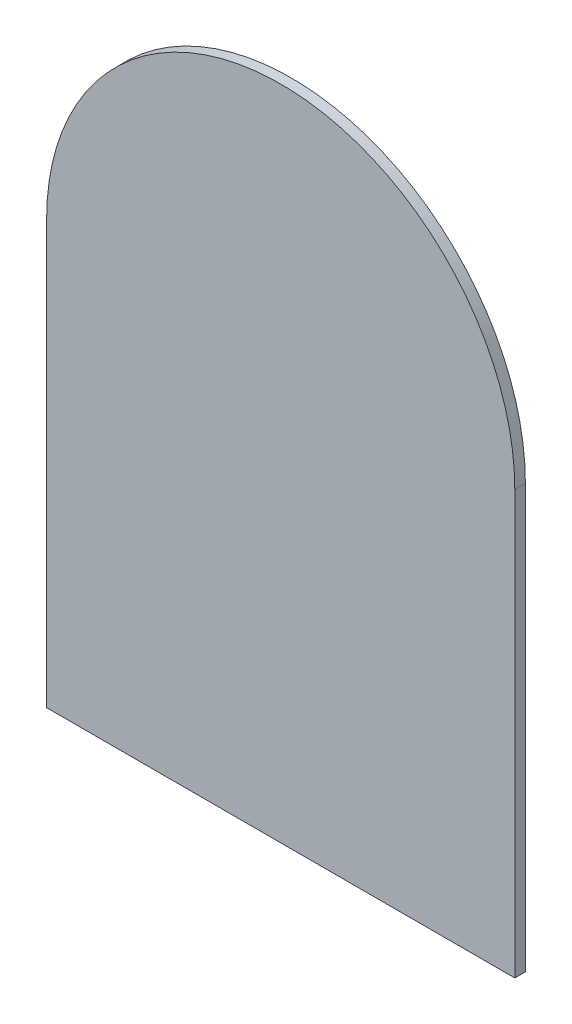
ISO-10303-21;
HEADER;
FILE_DESCRIPTION(('STEP AP214'),'2;1');
FILE_NAME('part.step','',(''),(''),'','','');
FILE_SCHEMA(('AUTOMOTIVE_DESIGN { 1 0 10303 214 1 1 1 1 }'));
ENDSEC;
DATA;
#1=APPLICATION_CONTEXT('core data for automotive mechanical design processes');
#2=APPLICATION_PROTOCOL_DEFINITION('international standard','automotive_design',2000,#1);
#3=PRODUCT_CONTEXT('',#1,'mechanical');
#4=PRODUCT('Part','Part','',(#3));
#5=PRODUCT_RELATED_PRODUCT_CATEGORY('part','',(#4));
#6=PRODUCT_DEFINITION_FORMATION('','',#4);
#7=PRODUCT_DEFINITION_CONTEXT('part definition',#1,'design');
#8=PRODUCT_DEFINITION('design','',#6,#7);
#9=PRODUCT_DEFINITION_SHAPE('','',#8);
#10=(LENGTH_UNIT() NAMED_UNIT(*) SI_UNIT(.MILLI.,.METRE.));
#11=(NAMED_UNIT(*) PLANE_ANGLE_UNIT() SI_UNIT($,.RADIAN.));
#12=(NAMED_UNIT(*) SI_UNIT($,.STERADIAN.) SOLID_ANGLE_UNIT());
#13=UNCERTAINTY_MEASURE_WITH_UNIT(LENGTH_MEASURE(1.E-05),#10,'distance_accuracy_value','');
#14=(GEOMETRIC_REPRESENTATION_CONTEXT(3) GLOBAL_UNCERTAINTY_ASSIGNED_CONTEXT((#13)) GLOBAL_UNIT_ASSIGNED_CONTEXT((#10,
#11,#12)) REPRESENTATION_CONTEXT('',''));
#15=CARTESIAN_POINT('',(0.,0.,0.));
#16=DIRECTION('',(0.,0.,1.));
#17=DIRECTION('',(1.,0.,0.));
#18=AXIS2_PLACEMENT_3D('',#15,#16,#17);
#19=CARTESIAN_POINT('',(0.,0.,10.));
#20=DIRECTION('',(-1.,0.,0.));
#21=DIRECTION('',(0.,0.,1.));
#22=AXIS2_PLACEMENT_3D('',#19,#20,#21);
#23=PLANE('',#22);
#24=DIRECTION('',(0.,1.,0.));
#25=VECTOR('',#24,1.);
#26=CARTESIAN_POINT('',(0.,0.,0.));
#27=LINE('',#26,#25);
#28=CARTESIAN_POINT('',(0.,0.,0.));
#29=VERTEX_POINT('',#28);
#30=CARTESIAN_POINT('',(0.,400.,0.));
#31=VERTEX_POINT('',#30);
#32=EDGE_CURVE('E107',#29,#31,#27,.T.);
#33=ORIENTED_EDGE('',*,*,#32,.T.);
#34=DIRECTION('',(0.,0.,-1.));
#35=VECTOR('',#34,1.);
#36=CARTESIAN_POINT('',(0.,400.,10.));
#37=LINE('',#36,#35);
#38=CARTESIAN_POINT('',(0.,400.,10.));
#39=VERTEX_POINT('',#38);
#40=EDGE_CURVE('E11',#39,#31,#37,.T.);
#41=ORIENTED_EDGE('',*,*,#40,.F.);
#42=DIRECTION('',(0.,1.,0.));
#43=VECTOR('',#42,1.);
#44=CARTESIAN_POINT('',(0.,0.,10.));
#45=LINE('',#44,#43);
#46=CARTESIAN_POINT('',(0.,0.,10.));
#47=VERTEX_POINT('',#46);
#48=EDGE_CURVE('E91',#47,#39,#45,.T.);
#49=ORIENTED_EDGE('',*,*,#48,.F.);
#50=DIRECTION('',(0.,0.,-1.));
#51=VECTOR('',#50,1.);
#52=CARTESIAN_POINT('',(0.,0.,10.));
#53=LINE('',#52,#51);
#54=EDGE_CURVE('E103',#47,#29,#53,.T.);
#55=ORIENTED_EDGE('',*,*,#54,.T.);
#56=EDGE_LOOP('',(#33,#41,#49,#55));
#57=FACE_BOUND('',#56,.T.);
#58=ADVANCED_FACE('F39',(#57),#23,.F.);
#59=CARTESIAN_POINT('',(-221.31,400.,10.));
#60=DIRECTION('',(0.,0.,-1.));
#61=DIRECTION('',(-1.,0.,0.));
#62=AXIS2_PLACEMENT_3D('',#59,#60,#61);
#63=CYLINDRICAL_SURFACE('',#62,221.31);
#64=CARTESIAN_POINT('',(-221.31,400.,0.));
#65=DIRECTION('',(0.,0.,1.));
#66=DIRECTION('',(1.,0.,0.));
#67=AXIS2_PLACEMENT_3D('',#64,#65,#66);
#68=CIRCLE('',#67,221.31);
#69=CARTESIAN_POINT('',(-442.62,400.,0.));
#70=VERTEX_POINT('',#69);
#71=EDGE_CURVE('E96',#31,#70,#68,.T.);
#72=ORIENTED_EDGE('',*,*,#71,.T.);
#73=DIRECTION('',(0.,0.,-1.));
#74=VECTOR('',#73,1.);
#75=CARTESIAN_POINT('',(-442.62,400.,10.));
#76=LINE('',#75,#74);
#77=CARTESIAN_POINT('',(-442.62,400.,10.));
#78=VERTEX_POINT('',#77);
#79=EDGE_CURVE('E48',#78,#70,#76,.T.);
#80=ORIENTED_EDGE('',*,*,#79,.F.);
#81=CARTESIAN_POINT('',(-221.31,400.,10.));
#82=DIRECTION('',(0.,0.,1.));
#83=DIRECTION('',(1.,0.,0.));
#84=AXIS2_PLACEMENT_3D('',#81,#82,#83);
#85=CIRCLE('',#84,221.31);
#86=EDGE_CURVE('E86',#39,#78,#85,.T.);
#87=ORIENTED_EDGE('',*,*,#86,.F.);
#88=ORIENTED_EDGE('',*,*,#40,.T.);
#89=EDGE_LOOP('',(#72,#80,#87,#88));
#90=FACE_BOUND('',#89,.T.);
#91=ADVANCED_FACE('F95',(#90),#63,.T.);
#92=CARTESIAN_POINT('',(-442.62,0.,10.));
#93=DIRECTION('',(1.,0.,0.));
#94=DIRECTION('',(0.,0.,-1.));
#95=AXIS2_PLACEMENT_3D('',#92,#93,#94);
#96=PLANE('',#95);
#97=DIRECTION('',(0.,-1.,0.));
#98=VECTOR('',#97,1.);
#99=CARTESIAN_POINT('',(-442.62,0.,0.));
#100=LINE('',#99,#98);
#101=CARTESIAN_POINT('',(-442.62,0.,0.));
#102=VERTEX_POINT('',#101);
#103=EDGE_CURVE('E73',#70,#102,#100,.T.);
#104=ORIENTED_EDGE('',*,*,#103,.T.);
#105=DIRECTION('',(0.,0.,-1.));
#106=VECTOR('',#105,1.);
#107=CARTESIAN_POINT('',(-442.62,0.,10.));
#108=LINE('',#107,#106);
#109=CARTESIAN_POINT('',(-442.62,0.,10.));
#110=VERTEX_POINT('',#109);
#111=EDGE_CURVE('E98',#110,#102,#108,.T.);
#112=ORIENTED_EDGE('',*,*,#111,.F.);
#113=DIRECTION('',(0.,-1.,0.));
#114=VECTOR('',#113,1.);
#115=CARTESIAN_POINT('',(-442.62,0.,10.));
#116=LINE('',#115,#114);
#117=EDGE_CURVE('E89',#78,#110,#116,.T.);
#118=ORIENTED_EDGE('',*,*,#117,.F.);
#119=ORIENTED_EDGE('',*,*,#79,.T.);
#120=EDGE_LOOP('',(#104,#112,#118,#119));
#121=FACE_BOUND('',#120,.T.);
#122=ADVANCED_FACE('F99',(#121),#96,.F.);
#123=CARTESIAN_POINT('',(0.,0.,10.));
#124=DIRECTION('',(0.,1.,0.));
#125=DIRECTION('',(0.,0.,1.));
#126=AXIS2_PLACEMENT_3D('',#123,#124,#125);
#127=PLANE('',#126);
#128=DIRECTION('',(1.,0.,0.));
#129=VECTOR('',#128,1.);
#130=CARTESIAN_POINT('',(0.,0.,0.));
#131=LINE('',#130,#129);
#132=EDGE_CURVE('E79',#102,#29,#131,.T.);
#133=ORIENTED_EDGE('',*,*,#132,.T.);
#134=ORIENTED_EDGE('',*,*,#54,.F.);
#135=DIRECTION('',(1.,0.,0.));
#136=VECTOR('',#135,1.);
#137=CARTESIAN_POINT('',(0.,0.,10.));
#138=LINE('',#137,#136);
#139=EDGE_CURVE('E56',#110,#47,#138,.T.);
#140=ORIENTED_EDGE('',*,*,#139,.F.);
#141=ORIENTED_EDGE('',*,*,#111,.T.);
#142=EDGE_LOOP('',(#133,#134,#140,#141));
#143=FACE_BOUND('',#142,.T.);
#144=ADVANCED_FACE('F120',(#143),#127,.F.);
#145=CARTESIAN_POINT('',(-221.31,400.,10.));
#146=DIRECTION('',(0.,0.,1.));
#147=DIRECTION('',(1.,0.,0.));
#148=AXIS2_PLACEMENT_3D('',#145,#146,#147);
#149=PLANE('',#148);
#150=ORIENTED_EDGE('',*,*,#48,.T.);
#151=ORIENTED_EDGE('',*,*,#86,.T.);
#152=ORIENTED_EDGE('',*,*,#117,.T.);
#153=ORIENTED_EDGE('',*,*,#139,.T.);
#154=EDGE_LOOP('',(#150,#151,#152,#153));
#155=FACE_BOUND('',#154,.T.);
#156=ADVANCED_FACE('F87',(#155),#149,.T.);
#157=CARTESIAN_POINT('',(-221.31,400.,0.));
#158=DIRECTION('',(0.,0.,1.));
#159=DIRECTION('',(1.,0.,0.));
#160=AXIS2_PLACEMENT_3D('',#157,#158,#159);
#161=PLANE('',#160);
#162=ORIENTED_EDGE('',*,*,#32,.F.);
#163=ORIENTED_EDGE('',*,*,#132,.F.);
#164=ORIENTED_EDGE('',*,*,#103,.F.);
#165=ORIENTED_EDGE('',*,*,#71,.F.);
#166=EDGE_LOOP('',(#162,#163,#164,#165));
#167=FACE_BOUND('',#166,.T.);
#168=ADVANCED_FACE('F123',(#167),#161,.F.);
#169=CLOSED_SHELL('',(#58,#91,#122,#144,#156,#168));
#170=MANIFOLD_SOLID_BREP('B2',#169);
#171=ADVANCED_BREP_SHAPE_REPRESENTATION('',(#18,#170),#14);
#172=SHAPE_DEFINITION_REPRESENTATION(#9,#171);
ENDSEC;
END-ISO-10303-21;
